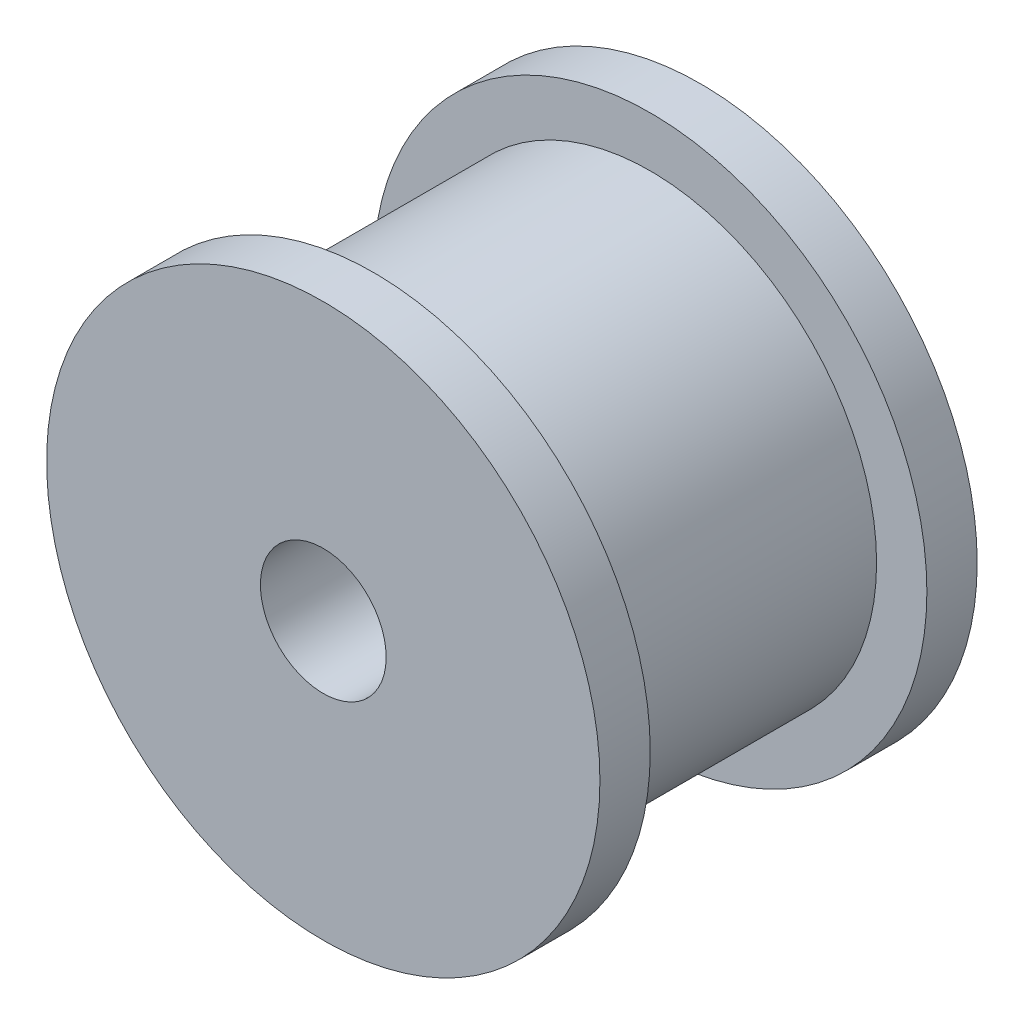
ISO-10303-21;
HEADER;
FILE_DESCRIPTION(('STEP AP214'),'2;1');
FILE_NAME('part.step','',(''),(''),'','','');
FILE_SCHEMA(('AUTOMOTIVE_DESIGN { 1 0 10303 214 1 1 1 1 }'));
ENDSEC;
DATA;
#1=APPLICATION_CONTEXT('core data for automotive mechanical design processes');
#2=APPLICATION_PROTOCOL_DEFINITION('international standard','automotive_design',2000,#1);
#3=PRODUCT_CONTEXT('',#1,'mechanical');
#4=PRODUCT('Part','Part','',(#3));
#5=PRODUCT_RELATED_PRODUCT_CATEGORY('part','',(#4));
#6=PRODUCT_DEFINITION_FORMATION('','',#4);
#7=PRODUCT_DEFINITION_CONTEXT('part definition',#1,'design');
#8=PRODUCT_DEFINITION('design','',#6,#7);
#9=PRODUCT_DEFINITION_SHAPE('','',#8);
#10=(LENGTH_UNIT() NAMED_UNIT(*) SI_UNIT(.MILLI.,.METRE.));
#11=(NAMED_UNIT(*) PLANE_ANGLE_UNIT() SI_UNIT($,.RADIAN.));
#12=(NAMED_UNIT(*) SI_UNIT($,.STERADIAN.) SOLID_ANGLE_UNIT());
#13=UNCERTAINTY_MEASURE_WITH_UNIT(LENGTH_MEASURE(1.E-05),#10,'distance_accuracy_value','');
#14=(GEOMETRIC_REPRESENTATION_CONTEXT(3) GLOBAL_UNCERTAINTY_ASSIGNED_CONTEXT((#13)) GLOBAL_UNIT_ASSIGNED_CONTEXT((#10,
#11,#12)) REPRESENTATION_CONTEXT('',''));
#15=CARTESIAN_POINT('',(0.,0.,0.));
#16=DIRECTION('',(0.,0.,1.));
#17=DIRECTION('',(1.,0.,0.));
#18=AXIS2_PLACEMENT_3D('',#15,#16,#17);
#19=CARTESIAN_POINT('',(0.,0.,2.));
#20=DIRECTION('',(0.,0.,1.));
#21=DIRECTION('',(1.,0.,0.));
#22=AXIS2_PLACEMENT_3D('',#19,#20,#21);
#23=PLANE('',#22);
#24=CARTESIAN_POINT('',(0.,0.,2.));
#25=DIRECTION('',(0.,0.,1.));
#26=DIRECTION('',(1.,0.,0.));
#27=AXIS2_PLACEMENT_3D('',#24,#25,#26);
#28=CIRCLE('',#27,9.);
#29=CARTESIAN_POINT('',(9.,0.,2.));
#30=VERTEX_POINT('',#29);
#31=EDGE_CURVE('E10',#30,#30,#28,.T.);
#32=ORIENTED_EDGE('',*,*,#31,.F.);
#33=EDGE_LOOP('',(#32));
#34=FACE_BOUND('',#33,.T.);
#35=CARTESIAN_POINT('',(0.,0.,2.));
#36=DIRECTION('',(0.,0.,1.));
#37=DIRECTION('',(1.,0.,0.));
#38=AXIS2_PLACEMENT_3D('',#35,#36,#37);
#39=CIRCLE('',#38,11.);
#40=CARTESIAN_POINT('',(11.,0.,2.));
#41=VERTEX_POINT('',#40);
#42=EDGE_CURVE('E43',#41,#41,#39,.T.);
#43=ORIENTED_EDGE('',*,*,#42,.T.);
#44=EDGE_LOOP('',(#43));
#45=FACE_BOUND('',#44,.T.);
#46=ADVANCED_FACE('F35',(#34,#45),#23,.T.);
#47=CARTESIAN_POINT('',(0.,0.,0.));
#48=DIRECTION('',(0.,0.,1.));
#49=DIRECTION('',(1.,0.,0.));
#50=AXIS2_PLACEMENT_3D('',#47,#48,#49);
#51=PLANE('',#50);
#52=CARTESIAN_POINT('',(0.,0.,0.));
#53=DIRECTION('',(0.,0.,1.));
#54=DIRECTION('',(1.,0.,0.));
#55=AXIS2_PLACEMENT_3D('',#52,#53,#54);
#56=CIRCLE('',#55,11.);
#57=CARTESIAN_POINT('',(11.,0.,0.));
#58=VERTEX_POINT('',#57);
#59=EDGE_CURVE('E39',#58,#58,#56,.T.);
#60=ORIENTED_EDGE('',*,*,#59,.F.);
#61=EDGE_LOOP('',(#60));
#62=FACE_BOUND('',#61,.T.);
#63=CARTESIAN_POINT('',(0.,0.,0.));
#64=DIRECTION('',(0.,0.,1.));
#65=DIRECTION('',(1.,0.,0.));
#66=AXIS2_PLACEMENT_3D('',#63,#64,#65);
#67=CIRCLE('',#66,2.5);
#68=CARTESIAN_POINT('',(2.5,0.,0.));
#69=VERTEX_POINT('',#68);
#70=EDGE_CURVE('E52',#69,#69,#67,.T.);
#71=ORIENTED_EDGE('',*,*,#70,.T.);
#72=EDGE_LOOP('',(#71));
#73=FACE_BOUND('',#72,.T.);
#74=ADVANCED_FACE('F88',(#62,#73),#51,.F.);
#75=CARTESIAN_POINT('',(0.,0.,2.));
#76=DIRECTION('',(0.,0.,-1.));
#77=DIRECTION('',(-1.,0.,0.));
#78=AXIS2_PLACEMENT_3D('',#75,#76,#77);
#79=CYLINDRICAL_SURFACE('',#78,11.);
#80=ORIENTED_EDGE('',*,*,#42,.F.);
#81=EDGE_LOOP('',(#80));
#82=FACE_BOUND('',#81,.T.);
#83=ORIENTED_EDGE('',*,*,#59,.T.);
#84=EDGE_LOOP('',(#83));
#85=FACE_BOUND('',#84,.T.);
#86=ADVANCED_FACE('F37',(#82,#85),#79,.T.);
#87=CARTESIAN_POINT('',(0.,0.,2.));
#88=DIRECTION('',(0.,0.,-1.));
#89=DIRECTION('',(-1.,0.,0.));
#90=AXIS2_PLACEMENT_3D('',#87,#88,#89);
#91=CYLINDRICAL_SURFACE('',#90,2.5);
#92=ORIENTED_EDGE('',*,*,#70,.F.);
#93=EDGE_LOOP('',(#92));
#94=FACE_BOUND('',#93,.T.);
#95=CARTESIAN_POINT('',(0.,0.,15.));
#96=DIRECTION('',(0.,0.,1.));
#97=DIRECTION('',(1.,0.,0.));
#98=AXIS2_PLACEMENT_3D('',#95,#96,#97);
#99=CIRCLE('',#98,2.5);
#100=CARTESIAN_POINT('',(2.5,0.,15.));
#101=VERTEX_POINT('',#100);
#102=EDGE_CURVE('E67',#101,#101,#99,.T.);
#103=ORIENTED_EDGE('',*,*,#102,.T.);
#104=EDGE_LOOP('',(#103));
#105=FACE_BOUND('',#104,.T.);
#106=ADVANCED_FACE('F72',(#94,#105),#91,.F.);
#107=CARTESIAN_POINT('',(0.,0.,13.));
#108=DIRECTION('',(0.,0.,-1.));
#109=DIRECTION('',(-1.,0.,0.));
#110=AXIS2_PLACEMENT_3D('',#107,#108,#109);
#111=CYLINDRICAL_SURFACE('',#110,9.);
#112=CARTESIAN_POINT('',(0.,0.,13.));
#113=DIRECTION('',(0.,0.,1.));
#114=DIRECTION('',(1.,0.,0.));
#115=AXIS2_PLACEMENT_3D('',#112,#113,#114);
#116=CIRCLE('',#115,9.);
#117=CARTESIAN_POINT('',(9.,0.,13.));
#118=VERTEX_POINT('',#117);
#119=EDGE_CURVE('E50',#118,#118,#116,.T.);
#120=ORIENTED_EDGE('',*,*,#119,.F.);
#121=EDGE_LOOP('',(#120));
#122=FACE_BOUND('',#121,.T.);
#123=ORIENTED_EDGE('',*,*,#31,.T.);
#124=EDGE_LOOP('',(#123));
#125=FACE_BOUND('',#124,.T.);
#126=ADVANCED_FACE('F77',(#122,#125),#111,.T.);
#127=CARTESIAN_POINT('',(0.,0.,15.));
#128=DIRECTION('',(0.,0.,1.));
#129=DIRECTION('',(1.,0.,0.));
#130=AXIS2_PLACEMENT_3D('',#127,#128,#129);
#131=PLANE('',#130);
#132=CARTESIAN_POINT('',(0.,0.,15.));
#133=DIRECTION('',(0.,0.,1.));
#134=DIRECTION('',(1.,0.,0.));
#135=AXIS2_PLACEMENT_3D('',#132,#133,#134);
#136=CIRCLE('',#135,11.);
#137=CARTESIAN_POINT('',(11.,0.,15.));
#138=VERTEX_POINT('',#137);
#139=EDGE_CURVE('E58',#138,#138,#136,.T.);
#140=ORIENTED_EDGE('',*,*,#139,.T.);
#141=EDGE_LOOP('',(#140));
#142=FACE_BOUND('',#141,.T.);
#143=ORIENTED_EDGE('',*,*,#102,.F.);
#144=EDGE_LOOP('',(#143));
#145=FACE_BOUND('',#144,.T.);
#146=ADVANCED_FACE('F74',(#142,#145),#131,.T.);
#147=CARTESIAN_POINT('',(0.,0.,13.));
#148=DIRECTION('',(0.,0.,1.));
#149=DIRECTION('',(1.,0.,0.));
#150=AXIS2_PLACEMENT_3D('',#147,#148,#149);
#151=PLANE('',#150);
#152=ORIENTED_EDGE('',*,*,#119,.T.);
#153=EDGE_LOOP('',(#152));
#154=FACE_BOUND('',#153,.T.);
#155=CARTESIAN_POINT('',(0.,0.,13.));
#156=DIRECTION('',(0.,0.,1.));
#157=DIRECTION('',(1.,0.,0.));
#158=AXIS2_PLACEMENT_3D('',#155,#156,#157);
#159=CIRCLE('',#158,11.);
#160=CARTESIAN_POINT('',(11.,0.,13.));
#161=VERTEX_POINT('',#160);
#162=EDGE_CURVE('E62',#161,#161,#159,.T.);
#163=ORIENTED_EDGE('',*,*,#162,.F.);
#164=EDGE_LOOP('',(#163));
#165=FACE_BOUND('',#164,.T.);
#166=ADVANCED_FACE('F76',(#154,#165),#151,.F.);
#167=CARTESIAN_POINT('',(0.,0.,15.));
#168=DIRECTION('',(0.,0.,-1.));
#169=DIRECTION('',(-1.,0.,0.));
#170=AXIS2_PLACEMENT_3D('',#167,#168,#169);
#171=CYLINDRICAL_SURFACE('',#170,11.);
#172=ORIENTED_EDGE('',*,*,#139,.F.);
#173=EDGE_LOOP('',(#172));
#174=FACE_BOUND('',#173,.T.);
#175=ORIENTED_EDGE('',*,*,#162,.T.);
#176=EDGE_LOOP('',(#175));
#177=FACE_BOUND('',#176,.T.);
#178=ADVANCED_FACE('F83',(#174,#177),#171,.T.);
#179=CLOSED_SHELL('',(#46,#74,#86,#106,#126,#146,#166,#178));
#180=MANIFOLD_SOLID_BREP('B2',#179);
#181=ADVANCED_BREP_SHAPE_REPRESENTATION('',(#18,#180),#14);
#182=SHAPE_DEFINITION_REPRESENTATION(#9,#181);
ENDSEC;
END-ISO-10303-21;
